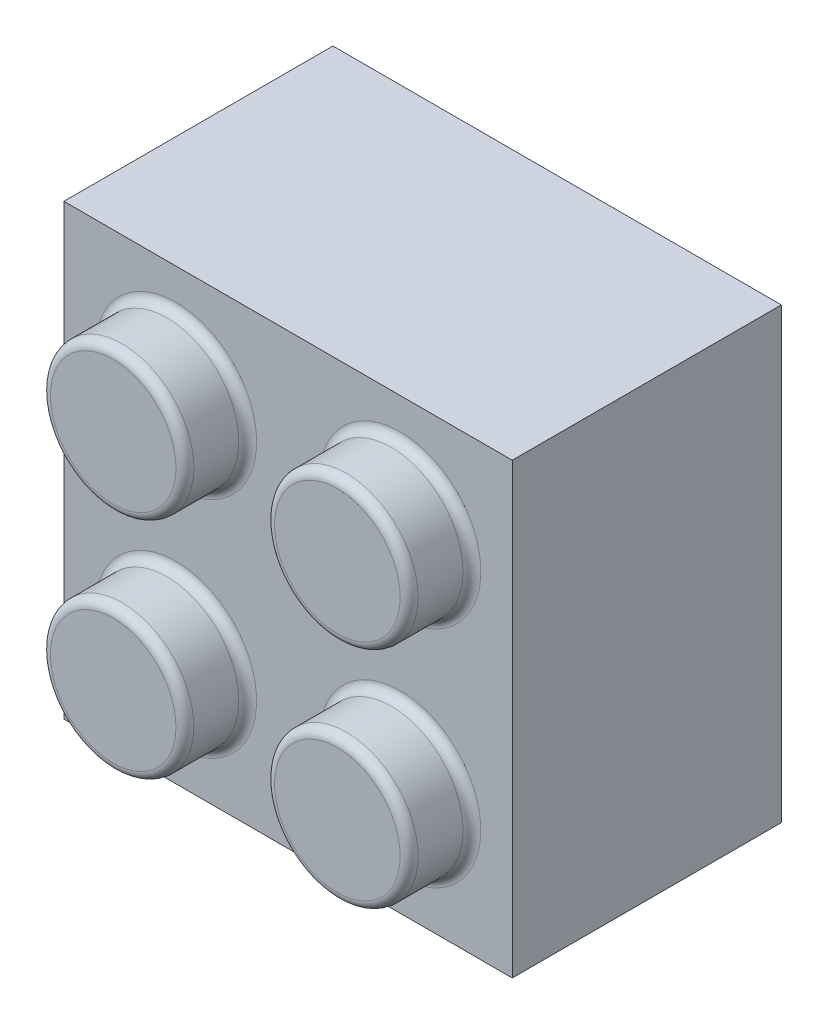
ISO-10303-21;
HEADER;
FILE_DESCRIPTION(('STEP AP214'),'2;1');
FILE_NAME('part.step','',(''),(''),'','','');
FILE_SCHEMA(('AUTOMOTIVE_DESIGN { 1 0 10303 214 1 1 1 1 }'));
ENDSEC;
DATA;
#1=APPLICATION_CONTEXT('core data for automotive mechanical design processes');
#2=APPLICATION_PROTOCOL_DEFINITION('international standard','automotive_design',2000,#1);
#3=PRODUCT_CONTEXT('',#1,'mechanical');
#4=PRODUCT('Part','Part','',(#3));
#5=PRODUCT_RELATED_PRODUCT_CATEGORY('part','',(#4));
#6=PRODUCT_DEFINITION_FORMATION('','',#4);
#7=PRODUCT_DEFINITION_CONTEXT('part definition',#1,'design');
#8=PRODUCT_DEFINITION('design','',#6,#7);
#9=PRODUCT_DEFINITION_SHAPE('','',#8);
#10=(LENGTH_UNIT() NAMED_UNIT(*) SI_UNIT(.MILLI.,.METRE.));
#11=(NAMED_UNIT(*) PLANE_ANGLE_UNIT() SI_UNIT($,.RADIAN.));
#12=(NAMED_UNIT(*) SI_UNIT($,.STERADIAN.) SOLID_ANGLE_UNIT());
#13=UNCERTAINTY_MEASURE_WITH_UNIT(LENGTH_MEASURE(1.E-05),#10,'distance_accuracy_value','');
#14=(GEOMETRIC_REPRESENTATION_CONTEXT(3) GLOBAL_UNCERTAINTY_ASSIGNED_CONTEXT((#13)) GLOBAL_UNIT_ASSIGNED_CONTEXT((#10,
#11,#12)) REPRESENTATION_CONTEXT('',''));
#15=CARTESIAN_POINT('',(0.,0.,0.));
#16=DIRECTION('',(0.,0.,1.));
#17=DIRECTION('',(1.,0.,0.));
#18=AXIS2_PLACEMENT_3D('',#15,#16,#17);
#19=CARTESIAN_POINT('',(-50.,-50.,60.));
#20=DIRECTION('',(1.,0.,0.));
#21=DIRECTION('',(0.,1.,0.));
#22=AXIS2_PLACEMENT_3D('',#19,#20,#21);
#23=PLANE('',#22);
#24=DIRECTION('',(0.,-1.,0.));
#25=VECTOR('',#24,1.);
#26=CARTESIAN_POINT('',(-50.,-50.,0.));
#27=LINE('',#26,#25);
#28=CARTESIAN_POINT('',(-50.,50.,0.));
#29=VERTEX_POINT('',#28);
#30=CARTESIAN_POINT('',(-50.,-50.,0.));
#31=VERTEX_POINT('',#30);
#32=EDGE_CURVE('E181',#29,#31,#27,.T.);
#33=ORIENTED_EDGE('',*,*,#32,.T.);
#34=DIRECTION('',(0.,0.,-1.));
#35=VECTOR('',#34,1.);
#36=CARTESIAN_POINT('',(-50.,-50.,60.));
#37=LINE('',#36,#35);
#38=CARTESIAN_POINT('',(-50.,-50.,60.));
#39=VERTEX_POINT('',#38);
#40=EDGE_CURVE('E218',#39,#31,#37,.T.);
#41=ORIENTED_EDGE('',*,*,#40,.F.);
#42=DIRECTION('',(0.,-1.,0.));
#43=VECTOR('',#42,1.);
#44=CARTESIAN_POINT('',(-50.,-50.,60.));
#45=LINE('',#44,#43);
#46=CARTESIAN_POINT('',(-50.,50.,60.));
#47=VERTEX_POINT('',#46);
#48=EDGE_CURVE('E187',#47,#39,#45,.T.);
#49=ORIENTED_EDGE('',*,*,#48,.F.);
#50=DIRECTION('',(0.,0.,-1.));
#51=VECTOR('',#50,1.);
#52=CARTESIAN_POINT('',(-50.,50.,60.));
#53=LINE('',#52,#51);
#54=EDGE_CURVE('E197',#47,#29,#53,.T.);
#55=ORIENTED_EDGE('',*,*,#54,.T.);
#56=EDGE_LOOP('',(#33,#41,#49,#55));
#57=FACE_BOUND('',#56,.T.);
#58=ADVANCED_FACE('F56',(#57),#23,.F.);
#59=CARTESIAN_POINT('',(50.,-50.,60.));
#60=DIRECTION('',(0.,1.,0.));
#61=DIRECTION('',(-1.,0.,0.));
#62=AXIS2_PLACEMENT_3D('',#59,#60,#61);
#63=PLANE('',#62);
#64=DIRECTION('',(1.,0.,0.));
#65=VECTOR('',#64,1.);
#66=CARTESIAN_POINT('',(50.,-50.,0.));
#67=LINE('',#66,#65);
#68=CARTESIAN_POINT('',(50.,-50.,0.));
#69=VERTEX_POINT('',#68);
#70=EDGE_CURVE('E201',#31,#69,#67,.T.);
#71=ORIENTED_EDGE('',*,*,#70,.T.);
#72=DIRECTION('',(0.,0.,-1.));
#73=VECTOR('',#72,1.);
#74=CARTESIAN_POINT('',(50.,-50.,60.));
#75=LINE('',#74,#73);
#76=CARTESIAN_POINT('',(50.,-50.,60.));
#77=VERTEX_POINT('',#76);
#78=EDGE_CURVE('E214',#77,#69,#75,.T.);
#79=ORIENTED_EDGE('',*,*,#78,.F.);
#80=DIRECTION('',(1.,0.,0.));
#81=VECTOR('',#80,1.);
#82=CARTESIAN_POINT('',(50.,-50.,60.));
#83=LINE('',#82,#81);
#84=EDGE_CURVE('E110',#39,#77,#83,.T.);
#85=ORIENTED_EDGE('',*,*,#84,.F.);
#86=ORIENTED_EDGE('',*,*,#40,.T.);
#87=EDGE_LOOP('',(#71,#79,#85,#86));
#88=FACE_BOUND('',#87,.T.);
#89=ADVANCED_FACE('F315',(#88),#63,.F.);
#90=CARTESIAN_POINT('',(50.,50.,60.));
#91=DIRECTION('',(-1.,0.,0.));
#92=DIRECTION('',(0.,-1.,0.));
#93=AXIS2_PLACEMENT_3D('',#90,#91,#92);
#94=PLANE('',#93);
#95=DIRECTION('',(0.,1.,0.));
#96=VECTOR('',#95,1.);
#97=CARTESIAN_POINT('',(50.,50.,0.));
#98=LINE('',#97,#96);
#99=CARTESIAN_POINT('',(50.,50.,0.));
#100=VERTEX_POINT('',#99);
#101=EDGE_CURVE('E204',#69,#100,#98,.T.);
#102=ORIENTED_EDGE('',*,*,#101,.T.);
#103=DIRECTION('',(0.,0.,-1.));
#104=VECTOR('',#103,1.);
#105=CARTESIAN_POINT('',(50.,50.,60.));
#106=LINE('',#105,#104);
#107=CARTESIAN_POINT('',(50.,50.,60.));
#108=VERTEX_POINT('',#107);
#109=EDGE_CURVE('E211',#108,#100,#106,.T.);
#110=ORIENTED_EDGE('',*,*,#109,.F.);
#111=DIRECTION('',(0.,1.,0.));
#112=VECTOR('',#111,1.);
#113=CARTESIAN_POINT('',(50.,50.,60.));
#114=LINE('',#113,#112);
#115=EDGE_CURVE('E192',#77,#108,#114,.T.);
#116=ORIENTED_EDGE('',*,*,#115,.F.);
#117=ORIENTED_EDGE('',*,*,#78,.T.);
#118=EDGE_LOOP('',(#102,#110,#116,#117));
#119=FACE_BOUND('',#118,.T.);
#120=ADVANCED_FACE('F320',(#119),#94,.F.);
#121=CARTESIAN_POINT('',(-50.,50.,60.));
#122=DIRECTION('',(0.,-1.,0.));
#123=DIRECTION('',(1.,0.,0.));
#124=AXIS2_PLACEMENT_3D('',#121,#122,#123);
#125=PLANE('',#124);
#126=DIRECTION('',(-1.,0.,0.));
#127=VECTOR('',#126,1.);
#128=CARTESIAN_POINT('',(-50.,50.,0.));
#129=LINE('',#128,#127);
#130=EDGE_CURVE('E102',#100,#29,#129,.T.);
#131=ORIENTED_EDGE('',*,*,#130,.T.);
#132=ORIENTED_EDGE('',*,*,#54,.F.);
#133=DIRECTION('',(-1.,0.,0.));
#134=VECTOR('',#133,1.);
#135=CARTESIAN_POINT('',(-50.,50.,60.));
#136=LINE('',#135,#134);
#137=EDGE_CURVE('E81',#108,#47,#136,.T.);
#138=ORIENTED_EDGE('',*,*,#137,.F.);
#139=ORIENTED_EDGE('',*,*,#109,.T.);
#140=EDGE_LOOP('',(#131,#132,#138,#139));
#141=FACE_BOUND('',#140,.T.);
#142=ADVANCED_FACE('F308',(#141),#125,.F.);
#143=CARTESIAN_POINT('',(0.,0.,60.));
#144=DIRECTION('',(0.,0.,-1.));
#145=DIRECTION('',(-1.,0.,0.));
#146=AXIS2_PLACEMENT_3D('',#143,#144,#145);
#147=PLANE('',#146);
#148=CARTESIAN_POINT('',(25.,-25.,60.));
#149=DIRECTION('',(0.,0.,-1.));
#150=DIRECTION('',(-1.,0.,0.));
#151=AXIS2_PLACEMENT_3D('',#148,#149,#150);
#152=CIRCLE('',#151,18.);
#153=CARTESIAN_POINT('',(7.00000000000001,-25.,60.));
#154=VERTEX_POINT('',#153);
#155=EDGE_CURVE('E249',#154,#154,#152,.T.);
#156=ORIENTED_EDGE('',*,*,#155,.T.);
#157=EDGE_LOOP('',(#156));
#158=FACE_BOUND('',#157,.T.);
#159=CARTESIAN_POINT('',(-25.,-25.,60.));
#160=DIRECTION('',(0.,0.,-1.));
#161=DIRECTION('',(-1.,0.,0.));
#162=AXIS2_PLACEMENT_3D('',#159,#160,#161);
#163=CIRCLE('',#162,18.);
#164=CARTESIAN_POINT('',(-43.,-25.,60.));
#165=VERTEX_POINT('',#164);
#166=EDGE_CURVE('E245',#165,#165,#163,.T.);
#167=ORIENTED_EDGE('',*,*,#166,.T.);
#168=EDGE_LOOP('',(#167));
#169=FACE_BOUND('',#168,.T.);
#170=CARTESIAN_POINT('',(25.,25.,60.));
#171=DIRECTION('',(0.,0.,-1.));
#172=DIRECTION('',(-1.,0.,0.));
#173=AXIS2_PLACEMENT_3D('',#170,#171,#172);
#174=CIRCLE('',#173,18.);
#175=CARTESIAN_POINT('',(7.,25.,60.));
#176=VERTEX_POINT('',#175);
#177=EDGE_CURVE('E241',#176,#176,#174,.T.);
#178=ORIENTED_EDGE('',*,*,#177,.T.);
#179=EDGE_LOOP('',(#178));
#180=FACE_BOUND('',#179,.T.);
#181=CARTESIAN_POINT('',(-25.,25.,60.));
#182=DIRECTION('',(0.,0.,-1.));
#183=DIRECTION('',(-1.,0.,0.));
#184=AXIS2_PLACEMENT_3D('',#181,#182,#183);
#185=CIRCLE('',#184,18.);
#186=CARTESIAN_POINT('',(-43.,25.,60.));
#187=VERTEX_POINT('',#186);
#188=EDGE_CURVE('E237',#187,#187,#185,.T.);
#189=ORIENTED_EDGE('',*,*,#188,.T.);
#190=EDGE_LOOP('',(#189));
#191=FACE_BOUND('',#190,.T.);
#192=ORIENTED_EDGE('',*,*,#48,.T.);
#193=ORIENTED_EDGE('',*,*,#84,.T.);
#194=ORIENTED_EDGE('',*,*,#115,.T.);
#195=ORIENTED_EDGE('',*,*,#137,.T.);
#196=EDGE_LOOP('',(#192,#193,#194,#195));
#197=FACE_BOUND('',#196,.T.);
#198=ADVANCED_FACE('F305',(#158,#169,#180,#191,#197),#147,.F.);
#199=CARTESIAN_POINT('',(0.,0.,0.));
#200=DIRECTION('',(0.,0.,-1.));
#201=DIRECTION('',(-1.,0.,0.));
#202=AXIS2_PLACEMENT_3D('',#199,#200,#201);
#203=PLANE('',#202);
#204=DIRECTION('',(0.,1.,0.));
#205=VECTOR('',#204,1.);
#206=CARTESIAN_POINT('',(-42.,0.,0.));
#207=LINE('',#206,#205);
#208=CARTESIAN_POINT('',(-42.,-42.,0.));
#209=VERTEX_POINT('',#208);
#210=CARTESIAN_POINT('',(-42.,42.,0.));
#211=VERTEX_POINT('',#210);
#212=EDGE_CURVE('E72',#209,#211,#207,.T.);
#213=ORIENTED_EDGE('',*,*,#212,.F.);
#214=DIRECTION('',(-1.,0.,0.));
#215=VECTOR('',#214,1.);
#216=CARTESIAN_POINT('',(0.,-42.,0.));
#217=LINE('',#216,#215);
#218=CARTESIAN_POINT('',(42.,-42.,0.));
#219=VERTEX_POINT('',#218);
#220=EDGE_CURVE('E155',#219,#209,#217,.T.);
#221=ORIENTED_EDGE('',*,*,#220,.F.);
#222=DIRECTION('',(0.,-1.,0.));
#223=VECTOR('',#222,1.);
#224=CARTESIAN_POINT('',(42.,0.,0.));
#225=LINE('',#224,#223);
#226=CARTESIAN_POINT('',(42.,42.,0.));
#227=VERTEX_POINT('',#226);
#228=EDGE_CURVE('E159',#227,#219,#225,.T.);
#229=ORIENTED_EDGE('',*,*,#228,.F.);
#230=DIRECTION('',(1.,0.,0.));
#231=VECTOR('',#230,1.);
#232=CARTESIAN_POINT('',(0.,42.,0.));
#233=LINE('',#232,#231);
#234=EDGE_CURVE('E171',#211,#227,#233,.T.);
#235=ORIENTED_EDGE('',*,*,#234,.F.);
#236=EDGE_LOOP('',(#213,#221,#229,#235));
#237=FACE_BOUND('',#236,.T.);
#238=ORIENTED_EDGE('',*,*,#32,.F.);
#239=ORIENTED_EDGE('',*,*,#130,.F.);
#240=ORIENTED_EDGE('',*,*,#101,.F.);
#241=ORIENTED_EDGE('',*,*,#70,.F.);
#242=EDGE_LOOP('',(#238,#239,#240,#241));
#243=FACE_BOUND('',#242,.T.);
#244=ADVANCED_FACE('F307',(#237,#243),#203,.T.);
#245=CARTESIAN_POINT('',(25.,25.,74.));
#246=DIRECTION('',(0.,0.,-1.));
#247=DIRECTION('',(-1.,0.,0.));
#248=AXIS2_PLACEMENT_3D('',#245,#246,#247);
#249=CYLINDRICAL_SURFACE('',#248,16.);
#250=CARTESIAN_POINT('',(25.,25.,62.));
#251=DIRECTION('',(0.,0.,-1.));
#252=DIRECTION('',(-1.,0.,0.));
#253=AXIS2_PLACEMENT_3D('',#250,#251,#252);
#254=CIRCLE('',#253,16.);
#255=CARTESIAN_POINT('',(9.,25.,62.));
#256=VERTEX_POINT('',#255);
#257=EDGE_CURVE('E281',#256,#256,#254,.F.);
#258=ORIENTED_EDGE('',*,*,#257,.T.);
#259=EDGE_LOOP('',(#258));
#260=FACE_BOUND('',#259,.T.);
#261=CARTESIAN_POINT('',(25.,25.,72.));
#262=DIRECTION('',(0.,0.,1.));
#263=DIRECTION('',(1.,0.,0.));
#264=AXIS2_PLACEMENT_3D('',#261,#262,#263);
#265=CIRCLE('',#264,16.);
#266=CARTESIAN_POINT('',(41.,25.,72.));
#267=VERTEX_POINT('',#266);
#268=EDGE_CURVE('E277',#267,#267,#265,.F.);
#269=ORIENTED_EDGE('',*,*,#268,.T.);
#270=EDGE_LOOP('',(#269));
#271=FACE_BOUND('',#270,.T.);
#272=ADVANCED_FACE('F323',(#260,#271),#249,.T.);
#273=CARTESIAN_POINT('',(0.,0.,74.));
#274=DIRECTION('',(0.,0.,1.));
#275=DIRECTION('',(1.,0.,0.));
#276=AXIS2_PLACEMENT_3D('',#273,#274,#275);
#277=PLANE('',#276);
#278=CARTESIAN_POINT('',(25.,25.,74.));
#279=DIRECTION('',(0.,0.,1.));
#280=DIRECTION('',(1.,0.,0.));
#281=AXIS2_PLACEMENT_3D('',#278,#279,#280);
#282=CIRCLE('',#281,14.);
#283=CARTESIAN_POINT('',(39.,25.,74.));
#284=VERTEX_POINT('',#283);
#285=EDGE_CURVE('E285',#284,#284,#282,.T.);
#286=ORIENTED_EDGE('',*,*,#285,.T.);
#287=EDGE_LOOP('',(#286));
#288=FACE_BOUND('',#287,.T.);
#289=ADVANCED_FACE('F330',(#288),#277,.T.);
#290=CARTESIAN_POINT('',(25.,-25.,74.));
#291=DIRECTION('',(0.,0.,-1.));
#292=DIRECTION('',(-1.,0.,0.));
#293=AXIS2_PLACEMENT_3D('',#290,#291,#292);
#294=CYLINDRICAL_SURFACE('',#293,16.);
#295=CARTESIAN_POINT('',(25.,-25.,62.));
#296=DIRECTION('',(0.,0.,-1.));
#297=DIRECTION('',(-1.,0.,0.));
#298=AXIS2_PLACEMENT_3D('',#295,#296,#297);
#299=CIRCLE('',#298,16.);
#300=CARTESIAN_POINT('',(9.00000000000001,-25.,62.));
#301=VERTEX_POINT('',#300);
#302=EDGE_CURVE('E257',#301,#301,#299,.F.);
#303=ORIENTED_EDGE('',*,*,#302,.T.);
#304=EDGE_LOOP('',(#303));
#305=FACE_BOUND('',#304,.T.);
#306=CARTESIAN_POINT('',(25.,-25.,72.));
#307=DIRECTION('',(0.,0.,1.));
#308=DIRECTION('',(1.,0.,0.));
#309=AXIS2_PLACEMENT_3D('',#306,#307,#308);
#310=CIRCLE('',#309,16.);
#311=CARTESIAN_POINT('',(41.,-25.,72.));
#312=VERTEX_POINT('',#311);
#313=EDGE_CURVE('E253',#312,#312,#310,.F.);
#314=ORIENTED_EDGE('',*,*,#313,.T.);
#315=EDGE_LOOP('',(#314));
#316=FACE_BOUND('',#315,.T.);
#317=ADVANCED_FACE('F383',(#305,#316),#294,.T.);
#318=CARTESIAN_POINT('',(0.,0.,74.));
#319=DIRECTION('',(0.,0.,1.));
#320=DIRECTION('',(1.,0.,0.));
#321=AXIS2_PLACEMENT_3D('',#318,#319,#320);
#322=PLANE('',#321);
#323=CARTESIAN_POINT('',(25.,-25.,74.));
#324=DIRECTION('',(0.,0.,1.));
#325=DIRECTION('',(1.,0.,0.));
#326=AXIS2_PLACEMENT_3D('',#323,#324,#325);
#327=CIRCLE('',#326,14.);
#328=CARTESIAN_POINT('',(39.,-25.,74.));
#329=VERTEX_POINT('',#328);
#330=EDGE_CURVE('E261',#329,#329,#327,.T.);
#331=ORIENTED_EDGE('',*,*,#330,.T.);
#332=EDGE_LOOP('',(#331));
#333=FACE_BOUND('',#332,.T.);
#334=ADVANCED_FACE('F388',(#333),#322,.T.);
#335=CARTESIAN_POINT('',(-25.,-25.,74.));
#336=DIRECTION('',(0.,0.,-1.));
#337=DIRECTION('',(-1.,0.,0.));
#338=AXIS2_PLACEMENT_3D('',#335,#336,#337);
#339=CYLINDRICAL_SURFACE('',#338,16.);
#340=CARTESIAN_POINT('',(-25.,-25.,62.));
#341=DIRECTION('',(0.,0.,-1.));
#342=DIRECTION('',(-1.,0.,0.));
#343=AXIS2_PLACEMENT_3D('',#340,#341,#342);
#344=CIRCLE('',#343,16.);
#345=CARTESIAN_POINT('',(-41.,-25.,62.));
#346=VERTEX_POINT('',#345);
#347=EDGE_CURVE('E269',#346,#346,#344,.F.);
#348=ORIENTED_EDGE('',*,*,#347,.T.);
#349=EDGE_LOOP('',(#348));
#350=FACE_BOUND('',#349,.T.);
#351=CARTESIAN_POINT('',(-25.,-25.,72.));
#352=DIRECTION('',(0.,0.,1.));
#353=DIRECTION('',(1.,0.,0.));
#354=AXIS2_PLACEMENT_3D('',#351,#352,#353);
#355=CIRCLE('',#354,16.);
#356=CARTESIAN_POINT('',(-9.00000000000001,-25.,72.));
#357=VERTEX_POINT('',#356);
#358=EDGE_CURVE('E265',#357,#357,#355,.F.);
#359=ORIENTED_EDGE('',*,*,#358,.T.);
#360=EDGE_LOOP('',(#359));
#361=FACE_BOUND('',#360,.T.);
#362=ADVANCED_FACE('F393',(#350,#361),#339,.T.);
#363=CARTESIAN_POINT('',(0.,0.,74.));
#364=DIRECTION('',(0.,0.,1.));
#365=DIRECTION('',(1.,0.,0.));
#366=AXIS2_PLACEMENT_3D('',#363,#364,#365);
#367=PLANE('',#366);
#368=CARTESIAN_POINT('',(-25.,-25.,74.));
#369=DIRECTION('',(0.,0.,1.));
#370=DIRECTION('',(1.,0.,0.));
#371=AXIS2_PLACEMENT_3D('',#368,#369,#370);
#372=CIRCLE('',#371,14.);
#373=CARTESIAN_POINT('',(-11.,-25.,74.));
#374=VERTEX_POINT('',#373);
#375=EDGE_CURVE('E273',#374,#374,#372,.T.);
#376=ORIENTED_EDGE('',*,*,#375,.T.);
#377=EDGE_LOOP('',(#376));
#378=FACE_BOUND('',#377,.T.);
#379=ADVANCED_FACE('F396',(#378),#367,.T.);
#380=CARTESIAN_POINT('',(-25.,25.,74.));
#381=DIRECTION('',(0.,0.,-1.));
#382=DIRECTION('',(-1.,0.,0.));
#383=AXIS2_PLACEMENT_3D('',#380,#381,#382);
#384=CYLINDRICAL_SURFACE('',#383,16.);
#385=CARTESIAN_POINT('',(-25.,25.,62.));
#386=DIRECTION('',(0.,0.,-1.));
#387=DIRECTION('',(-1.,0.,0.));
#388=AXIS2_PLACEMENT_3D('',#385,#386,#387);
#389=CIRCLE('',#388,16.);
#390=CARTESIAN_POINT('',(-41.,25.,62.));
#391=VERTEX_POINT('',#390);
#392=EDGE_CURVE('E65',#391,#391,#389,.F.);
#393=ORIENTED_EDGE('',*,*,#392,.T.);
#394=EDGE_LOOP('',(#393));
#395=FACE_BOUND('',#394,.T.);
#396=CARTESIAN_POINT('',(-25.,25.,72.));
#397=DIRECTION('',(0.,0.,-1.));
#398=DIRECTION('',(-1.,0.,0.));
#399=AXIS2_PLACEMENT_3D('',#396,#397,#398);
#400=CIRCLE('',#399,16.);
#401=CARTESIAN_POINT('',(-41.,25.,72.));
#402=VERTEX_POINT('',#401);
#403=EDGE_CURVE('E289',#402,#402,#400,.T.);
#404=ORIENTED_EDGE('',*,*,#403,.T.);
#405=EDGE_LOOP('',(#404));
#406=FACE_BOUND('',#405,.T.);
#407=ADVANCED_FACE('F296',(#395,#406),#384,.T.);
#408=CARTESIAN_POINT('',(-25.,25.,74.));
#409=DIRECTION('',(0.,0.,-1.));
#410=DIRECTION('',(-1.,0.,0.));
#411=AXIS2_PLACEMENT_3D('',#408,#409,#410);
#412=PLANE('',#411);
#413=CARTESIAN_POINT('',(-25.,25.,74.));
#414=DIRECTION('',(0.,0.,-1.));
#415=DIRECTION('',(-1.,0.,0.));
#416=AXIS2_PLACEMENT_3D('',#413,#414,#415);
#417=CIRCLE('',#416,14.);
#418=CARTESIAN_POINT('',(-39.,25.,74.));
#419=VERTEX_POINT('',#418);
#420=EDGE_CURVE('E12',#419,#419,#417,.F.);
#421=ORIENTED_EDGE('',*,*,#420,.T.);
#422=EDGE_LOOP('',(#421));
#423=FACE_BOUND('',#422,.T.);
#424=ADVANCED_FACE('F403',(#423),#412,.F.);
#425=CARTESIAN_POINT('',(-42.,0.,50.0000000000001));
#426=DIRECTION('',(-1.,0.,0.));
#427=DIRECTION('',(0.,0.,1.));
#428=AXIS2_PLACEMENT_3D('',#425,#426,#427);
#429=PLANE('',#428);
#430=ORIENTED_EDGE('',*,*,#212,.T.);
#431=DIRECTION('',(0.,0.,-1.));
#432=VECTOR('',#431,1.);
#433=CARTESIAN_POINT('',(-42.,42.,50.0000000000001));
#434=LINE('',#433,#432);
#435=CARTESIAN_POINT('',(-42.,42.,50.0000000000001));
#436=VERTEX_POINT('',#435);
#437=EDGE_CURVE('E130',#436,#211,#434,.T.);
#438=ORIENTED_EDGE('',*,*,#437,.F.);
#439=DIRECTION('',(0.,1.,0.));
#440=VECTOR('',#439,1.);
#441=CARTESIAN_POINT('',(-42.,0.,50.0000000000001));
#442=LINE('',#441,#440);
#443=CARTESIAN_POINT('',(-42.,-42.,50.0000000000001));
#444=VERTEX_POINT('',#443);
#445=EDGE_CURVE('E134',#444,#436,#442,.T.);
#446=ORIENTED_EDGE('',*,*,#445,.F.);
#447=DIRECTION('',(0.,0.,-1.));
#448=VECTOR('',#447,1.);
#449=CARTESIAN_POINT('',(-42.,-42.,50.0000000000001));
#450=LINE('',#449,#448);
#451=EDGE_CURVE('E178',#444,#209,#450,.T.);
#452=ORIENTED_EDGE('',*,*,#451,.T.);
#453=EDGE_LOOP('',(#430,#438,#446,#452));
#454=FACE_BOUND('',#453,.T.);
#455=ADVANCED_FACE('F132',(#454),#429,.F.);
#456=CARTESIAN_POINT('',(0.,-42.,50.0000000000001));
#457=DIRECTION('',(0.,-1.,0.));
#458=DIRECTION('',(0.,0.,-1.));
#459=AXIS2_PLACEMENT_3D('',#456,#457,#458);
#460=PLANE('',#459);
#461=ORIENTED_EDGE('',*,*,#220,.T.);
#462=ORIENTED_EDGE('',*,*,#451,.F.);
#463=DIRECTION('',(-1.,0.,0.));
#464=VECTOR('',#463,1.);
#465=CARTESIAN_POINT('',(0.,-42.,50.0000000000001));
#466=LINE('',#465,#464);
#467=CARTESIAN_POINT('',(42.,-42.,50.0000000000001));
#468=VERTEX_POINT('',#467);
#469=EDGE_CURVE('E141',#468,#444,#466,.T.);
#470=ORIENTED_EDGE('',*,*,#469,.F.);
#471=DIRECTION('',(0.,0.,-1.));
#472=VECTOR('',#471,1.);
#473=CARTESIAN_POINT('',(42.,-42.,50.0000000000001));
#474=LINE('',#473,#472);
#475=EDGE_CURVE('E182',#468,#219,#474,.T.);
#476=ORIENTED_EDGE('',*,*,#475,.T.);
#477=EDGE_LOOP('',(#461,#462,#470,#476));
#478=FACE_BOUND('',#477,.T.);
#479=ADVANCED_FACE('F416',(#478),#460,.F.);
#480=CARTESIAN_POINT('',(42.,0.,50.0000000000001));
#481=DIRECTION('',(1.,0.,0.));
#482=DIRECTION('',(0.,0.,-1.));
#483=AXIS2_PLACEMENT_3D('',#480,#481,#482);
#484=PLANE('',#483);
#485=ORIENTED_EDGE('',*,*,#228,.T.);
#486=ORIENTED_EDGE('',*,*,#475,.F.);
#487=DIRECTION('',(0.,-1.,0.));
#488=VECTOR('',#487,1.);
#489=CARTESIAN_POINT('',(42.,0.,50.0000000000001));
#490=LINE('',#489,#488);
#491=CARTESIAN_POINT('',(42.,42.,50.0000000000001));
#492=VERTEX_POINT('',#491);
#493=EDGE_CURVE('E150',#492,#468,#490,.T.);
#494=ORIENTED_EDGE('',*,*,#493,.F.);
#495=DIRECTION('',(0.,0.,-1.));
#496=VECTOR('',#495,1.);
#497=CARTESIAN_POINT('',(42.,42.,50.0000000000001));
#498=LINE('',#497,#496);
#499=EDGE_CURVE('E140',#492,#227,#498,.T.);
#500=ORIENTED_EDGE('',*,*,#499,.T.);
#501=EDGE_LOOP('',(#485,#486,#494,#500));
#502=FACE_BOUND('',#501,.T.);
#503=ADVANCED_FACE('F412',(#502),#484,.F.);
#504=CARTESIAN_POINT('',(0.,0.,50.0000000000001));
#505=DIRECTION('',(0.,0.,-1.));
#506=DIRECTION('',(-1.,0.,0.));
#507=AXIS2_PLACEMENT_3D('',#504,#505,#506);
#508=CYLINDRICAL_SURFACE('',#507,18.5);
#509=CARTESIAN_POINT('',(0.,0.,48.0000000000001));
#510=DIRECTION('',(0.,0.,-1.));
#511=DIRECTION('',(-1.,0.,0.));
#512=AXIS2_PLACEMENT_3D('',#509,#510,#511);
#513=CIRCLE('',#512,18.5);
#514=CARTESIAN_POINT('',(-18.5,0.,48.0000000000001));
#515=VERTEX_POINT('',#514);
#516=EDGE_CURVE('E225',#515,#515,#513,.T.);
#517=ORIENTED_EDGE('',*,*,#516,.T.);
#518=EDGE_LOOP('',(#517));
#519=FACE_BOUND('',#518,.T.);
#520=CARTESIAN_POINT('',(0.,0.,2.));
#521=DIRECTION('',(0.,0.,-1.));
#522=DIRECTION('',(-1.,0.,0.));
#523=AXIS2_PLACEMENT_3D('',#520,#521,#522);
#524=CIRCLE('',#523,18.5);
#525=CARTESIAN_POINT('',(-18.5,0.,2.));
#526=VERTEX_POINT('',#525);
#527=EDGE_CURVE('E221',#526,#526,#524,.F.);
#528=ORIENTED_EDGE('',*,*,#527,.T.);
#529=EDGE_LOOP('',(#528));
#530=FACE_BOUND('',#529,.T.);
#531=ADVANCED_FACE('F409',(#519,#530),#508,.T.);
#532=CARTESIAN_POINT('',(0.,42.,50.0000000000001));
#533=DIRECTION('',(0.,1.,0.));
#534=DIRECTION('',(0.,0.,1.));
#535=AXIS2_PLACEMENT_3D('',#532,#533,#534);
#536=PLANE('',#535);
#537=ORIENTED_EDGE('',*,*,#234,.T.);
#538=ORIENTED_EDGE('',*,*,#499,.F.);
#539=DIRECTION('',(1.,0.,0.));
#540=VECTOR('',#539,1.);
#541=CARTESIAN_POINT('',(0.,42.,50.0000000000001));
#542=LINE('',#541,#540);
#543=EDGE_CURVE('E144',#436,#492,#542,.T.);
#544=ORIENTED_EDGE('',*,*,#543,.F.);
#545=ORIENTED_EDGE('',*,*,#437,.T.);
#546=EDGE_LOOP('',(#537,#538,#544,#545));
#547=FACE_BOUND('',#546,.T.);
#548=ADVANCED_FACE('F145',(#547),#536,.F.);
#549=CARTESIAN_POINT('',(0.,0.,50.0000000000001));
#550=DIRECTION('',(0.,0.,-1.));
#551=DIRECTION('',(-1.,0.,0.));
#552=AXIS2_PLACEMENT_3D('',#549,#550,#551);
#553=PLANE('',#552);
#554=CARTESIAN_POINT('',(0.,0.,50.0000000000001));
#555=DIRECTION('',(0.,0.,-1.));
#556=DIRECTION('',(-1.,0.,0.));
#557=AXIS2_PLACEMENT_3D('',#554,#555,#556);
#558=CIRCLE('',#557,20.5);
#559=CARTESIAN_POINT('',(-20.5,0.,50.0000000000001));
#560=VERTEX_POINT('',#559);
#561=EDGE_CURVE('E229',#560,#560,#558,.F.);
#562=ORIENTED_EDGE('',*,*,#561,.T.);
#563=EDGE_LOOP('',(#562));
#564=FACE_BOUND('',#563,.T.);
#565=ORIENTED_EDGE('',*,*,#445,.T.);
#566=ORIENTED_EDGE('',*,*,#543,.T.);
#567=ORIENTED_EDGE('',*,*,#493,.T.);
#568=ORIENTED_EDGE('',*,*,#469,.T.);
#569=EDGE_LOOP('',(#565,#566,#567,#568));
#570=FACE_BOUND('',#569,.T.);
#571=ADVANCED_FACE('F152',(#564,#570),#553,.T.);
#572=CARTESIAN_POINT('',(0.,0.,0.));
#573=DIRECTION('',(0.,0.,-1.));
#574=DIRECTION('',(-1.,0.,0.));
#575=AXIS2_PLACEMENT_3D('',#572,#573,#574);
#576=CIRCLE('',#575,16.5);
#577=CARTESIAN_POINT('',(-16.5,0.,0.));
#578=VERTEX_POINT('',#577);
#579=EDGE_CURVE('E233',#578,#578,#576,.T.);
#580=ORIENTED_EDGE('',*,*,#579,.T.);
#581=EDGE_LOOP('',(#580));
#582=FACE_BOUND('',#581,.T.);
#583=CARTESIAN_POINT('',(0.,0.,0.));
#584=DIRECTION('',(0.,0.,-1.));
#585=DIRECTION('',(-1.,0.,0.));
#586=AXIS2_PLACEMENT_3D('',#583,#584,#585);
#587=CIRCLE('',#586,12.);
#588=CARTESIAN_POINT('',(-12.,0.,0.));
#589=VERTEX_POINT('',#588);
#590=EDGE_CURVE('E162',#589,#589,#587,.T.);
#591=ORIENTED_EDGE('',*,*,#590,.F.);
#592=EDGE_LOOP('',(#591));
#593=FACE_BOUND('',#592,.T.);
#594=ADVANCED_FACE('F326',(#582,#593),#203,.T.);
#595=CARTESIAN_POINT('',(0.,0.,50.0000000000001));
#596=DIRECTION('',(0.,0.,-1.));
#597=DIRECTION('',(-1.,0.,0.));
#598=AXIS2_PLACEMENT_3D('',#595,#596,#597);
#599=CYLINDRICAL_SURFACE('',#598,12.);
#600=CARTESIAN_POINT('',(0.,0.,50.0000000000001));
#601=DIRECTION('',(0.,0.,-1.));
#602=DIRECTION('',(-1.,0.,0.));
#603=AXIS2_PLACEMENT_3D('',#600,#601,#602);
#604=CIRCLE('',#603,12.);
#605=CARTESIAN_POINT('',(-12.,0.,50.0000000000001));
#606=VERTEX_POINT('',#605);
#607=EDGE_CURVE('E172',#606,#606,#604,.T.);
#608=ORIENTED_EDGE('',*,*,#607,.F.);
#609=EDGE_LOOP('',(#608));
#610=FACE_BOUND('',#609,.T.);
#611=ORIENTED_EDGE('',*,*,#590,.T.);
#612=EDGE_LOOP('',(#611));
#613=FACE_BOUND('',#612,.T.);
#614=ADVANCED_FACE('F335',(#610,#613),#599,.F.);
#615=CARTESIAN_POINT('',(0.,0.,50.0000000000001));
#616=DIRECTION('',(0.,0.,-1.));
#617=DIRECTION('',(-1.,0.,0.));
#618=AXIS2_PLACEMENT_3D('',#615,#616,#617);
#619=PLANE('',#618);
#620=ORIENTED_EDGE('',*,*,#607,.T.);
#621=EDGE_LOOP('',(#620));
#622=FACE_BOUND('',#621,.T.);
#623=ADVANCED_FACE('F349',(#622),#619,.T.);
#624=CARTESIAN_POINT('',(0.,0.,48.0000000000001));
#625=DIRECTION('',(0.,0.,-1.));
#626=DIRECTION('',(-1.,0.,0.));
#627=AXIS2_PLACEMENT_3D('',#624,#625,#626);
#628=TOROIDAL_SURFACE('',#627,20.5,2.);
#629=ORIENTED_EDGE('',*,*,#561,.F.);
#630=EDGE_LOOP('',(#629));
#631=FACE_BOUND('',#630,.T.);
#632=ORIENTED_EDGE('',*,*,#516,.F.);
#633=EDGE_LOOP('',(#632));
#634=FACE_BOUND('',#633,.T.);
#635=ADVANCED_FACE('F345',(#631,#634),#628,.F.);
#636=CARTESIAN_POINT('',(0.,0.,2.));
#637=DIRECTION('',(0.,0.,-1.));
#638=DIRECTION('',(-1.,0.,0.));
#639=AXIS2_PLACEMENT_3D('',#636,#637,#638);
#640=TOROIDAL_SURFACE('',#639,16.5,2.);
#641=ORIENTED_EDGE('',*,*,#527,.F.);
#642=EDGE_LOOP('',(#641));
#643=FACE_BOUND('',#642,.T.);
#644=ORIENTED_EDGE('',*,*,#579,.F.);
#645=EDGE_LOOP('',(#644));
#646=FACE_BOUND('',#645,.T.);
#647=ADVANCED_FACE('F348',(#643,#646),#640,.T.);
#648=CARTESIAN_POINT('',(25.,-25.,62.));
#649=DIRECTION('',(0.,0.,-1.));
#650=DIRECTION('',(-1.,0.,0.));
#651=AXIS2_PLACEMENT_3D('',#648,#649,#650);
#652=TOROIDAL_SURFACE('',#651,18.,2.);
#653=ORIENTED_EDGE('',*,*,#302,.F.);
#654=EDGE_LOOP('',(#653));
#655=FACE_BOUND('',#654,.T.);
#656=ORIENTED_EDGE('',*,*,#155,.F.);
#657=EDGE_LOOP('',(#656));
#658=FACE_BOUND('',#657,.T.);
#659=ADVANCED_FACE('F353',(#655,#658),#652,.F.);
#660=CARTESIAN_POINT('',(25.,-25.,72.));
#661=DIRECTION('',(0.,0.,1.));
#662=DIRECTION('',(1.,0.,0.));
#663=AXIS2_PLACEMENT_3D('',#660,#661,#662);
#664=TOROIDAL_SURFACE('',#663,14.,2.);
#665=ORIENTED_EDGE('',*,*,#330,.F.);
#666=EDGE_LOOP('',(#665));
#667=FACE_BOUND('',#666,.T.);
#668=ORIENTED_EDGE('',*,*,#313,.F.);
#669=EDGE_LOOP('',(#668));
#670=FACE_BOUND('',#669,.T.);
#671=ADVANCED_FACE('F357',(#667,#670),#664,.T.);
#672=CARTESIAN_POINT('',(-25.,-25.,62.));
#673=DIRECTION('',(0.,0.,-1.));
#674=DIRECTION('',(-1.,0.,0.));
#675=AXIS2_PLACEMENT_3D('',#672,#673,#674);
#676=TOROIDAL_SURFACE('',#675,18.,2.);
#677=ORIENTED_EDGE('',*,*,#166,.F.);
#678=EDGE_LOOP('',(#677));
#679=FACE_BOUND('',#678,.T.);
#680=ORIENTED_EDGE('',*,*,#347,.F.);
#681=EDGE_LOOP('',(#680));
#682=FACE_BOUND('',#681,.T.);
#683=ADVANCED_FACE('F361',(#679,#682),#676,.F.);
#684=CARTESIAN_POINT('',(-25.,-25.,72.));
#685=DIRECTION('',(0.,0.,1.));
#686=DIRECTION('',(1.,0.,0.));
#687=AXIS2_PLACEMENT_3D('',#684,#685,#686);
#688=TOROIDAL_SURFACE('',#687,14.,2.);
#689=ORIENTED_EDGE('',*,*,#358,.F.);
#690=EDGE_LOOP('',(#689));
#691=FACE_BOUND('',#690,.T.);
#692=ORIENTED_EDGE('',*,*,#375,.F.);
#693=EDGE_LOOP('',(#692));
#694=FACE_BOUND('',#693,.T.);
#695=ADVANCED_FACE('F365',(#691,#694),#688,.T.);
#696=CARTESIAN_POINT('',(25.,25.,62.));
#697=DIRECTION('',(0.,0.,-1.));
#698=DIRECTION('',(-1.,0.,0.));
#699=AXIS2_PLACEMENT_3D('',#696,#697,#698);
#700=TOROIDAL_SURFACE('',#699,18.,2.);
#701=ORIENTED_EDGE('',*,*,#177,.F.);
#702=EDGE_LOOP('',(#701));
#703=FACE_BOUND('',#702,.T.);
#704=ORIENTED_EDGE('',*,*,#257,.F.);
#705=EDGE_LOOP('',(#704));
#706=FACE_BOUND('',#705,.T.);
#707=ADVANCED_FACE('F369',(#703,#706),#700,.F.);
#708=CARTESIAN_POINT('',(25.,25.,72.));
#709=DIRECTION('',(0.,0.,1.));
#710=DIRECTION('',(1.,0.,0.));
#711=AXIS2_PLACEMENT_3D('',#708,#709,#710);
#712=TOROIDAL_SURFACE('',#711,14.,2.);
#713=ORIENTED_EDGE('',*,*,#268,.F.);
#714=EDGE_LOOP('',(#713));
#715=FACE_BOUND('',#714,.T.);
#716=ORIENTED_EDGE('',*,*,#285,.F.);
#717=EDGE_LOOP('',(#716));
#718=FACE_BOUND('',#717,.T.);
#719=ADVANCED_FACE('F302',(#715,#718),#712,.T.);
#720=CARTESIAN_POINT('',(-25.,25.,62.));
#721=DIRECTION('',(0.,0.,-1.));
#722=DIRECTION('',(-1.,0.,0.));
#723=AXIS2_PLACEMENT_3D('',#720,#721,#722);
#724=TOROIDAL_SURFACE('',#723,18.,2.);
#725=ORIENTED_EDGE('',*,*,#392,.F.);
#726=EDGE_LOOP('',(#725));
#727=FACE_BOUND('',#726,.T.);
#728=ORIENTED_EDGE('',*,*,#188,.F.);
#729=EDGE_LOOP('',(#728));
#730=FACE_BOUND('',#729,.T.);
#731=ADVANCED_FACE('F299',(#727,#730),#724,.F.);
#732=CARTESIAN_POINT('',(-25.,25.,72.));
#733=DIRECTION('',(0.,0.,-1.));
#734=DIRECTION('',(-1.,0.,0.));
#735=AXIS2_PLACEMENT_3D('',#732,#733,#734);
#736=TOROIDAL_SURFACE('',#735,14.,2.);
#737=ORIENTED_EDGE('',*,*,#420,.F.);
#738=EDGE_LOOP('',(#737));
#739=FACE_BOUND('',#738,.T.);
#740=ORIENTED_EDGE('',*,*,#403,.F.);
#741=EDGE_LOOP('',(#740));
#742=FACE_BOUND('',#741,.T.);
#743=ADVANCED_FACE('F58',(#739,#742),#736,.T.);
#744=CLOSED_SHELL('',(#58,#89,#120,#142,#198,#244,#272,#289,#317,#334,#362,#379,#407,#424,#455,
#479,#503,#531,#548,#571,#594,#614,#623,#635,#647,#659,#671,#683,#695,#707,#719,#731,#743));
#745=MANIFOLD_SOLID_BREP('B2',#744);
#746=ADVANCED_BREP_SHAPE_REPRESENTATION('',(#18,#745),#14);
#747=SHAPE_DEFINITION_REPRESENTATION(#9,#746);
ENDSEC;
END-ISO-10303-21;
